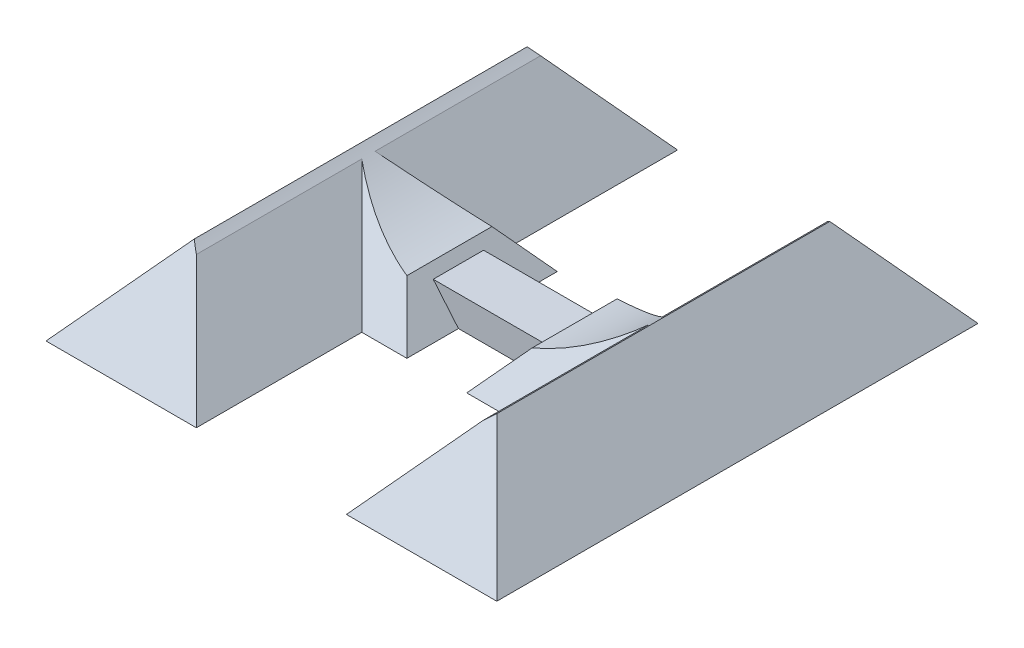
ISO-10303-21;
HEADER;
FILE_DESCRIPTION(('STEP AP214'),'2;1');
FILE_NAME('part.step','',(''),(''),'','','');
FILE_SCHEMA(('AUTOMOTIVE_DESIGN { 1 0 10303 214 1 1 1 1 }'));
ENDSEC;
DATA;
#1=APPLICATION_CONTEXT('core data for automotive mechanical design processes');
#2=APPLICATION_PROTOCOL_DEFINITION('international standard','automotive_design',2000,#1);
#3=PRODUCT_CONTEXT('',#1,'mechanical');
#4=PRODUCT('Part','Part','',(#3));
#5=PRODUCT_RELATED_PRODUCT_CATEGORY('part','',(#4));
#6=PRODUCT_DEFINITION_FORMATION('','',#4);
#7=PRODUCT_DEFINITION_CONTEXT('part definition',#1,'design');
#8=PRODUCT_DEFINITION('design','',#6,#7);
#9=PRODUCT_DEFINITION_SHAPE('','',#8);
#10=(LENGTH_UNIT() NAMED_UNIT(*) SI_UNIT(.MILLI.,.METRE.));
#11=(NAMED_UNIT(*) PLANE_ANGLE_UNIT() SI_UNIT($,.RADIAN.));
#12=(NAMED_UNIT(*) SI_UNIT($,.STERADIAN.) SOLID_ANGLE_UNIT());
#13=UNCERTAINTY_MEASURE_WITH_UNIT(LENGTH_MEASURE(1.E-05),#10,'distance_accuracy_value','');
#14=(GEOMETRIC_REPRESENTATION_CONTEXT(3) GLOBAL_UNCERTAINTY_ASSIGNED_CONTEXT((#13)) GLOBAL_UNIT_ASSIGNED_CONTEXT((#10,
#11,#12)) REPRESENTATION_CONTEXT('',''));
#15=CARTESIAN_POINT('',(0.,0.,0.));
#16=DIRECTION('',(0.,0.,1.));
#17=DIRECTION('',(1.,0.,0.));
#18=AXIS2_PLACEMENT_3D('',#15,#16,#17);
#19=CARTESIAN_POINT('',(0.,0.,0.));
#20=DIRECTION('',(-0.766044443118977,0.64278760968654,0.));
#21=DIRECTION('',(-0.64278760968654,-0.766044443118977,0.));
#22=AXIS2_PLACEMENT_3D('',#19,#20,#21);
#23=PLANE('',#22);
#24=DIRECTION('',(-0.540716203060937,-0.644400477571771,0.540716203060937));
#25=VECTOR('',#24,1.);
#26=CARTESIAN_POINT('',(0.,0.,0.));
#27=LINE('',#26,#25);
#28=CARTESIAN_POINT('',(10.8624666441013,12.9453836475425,-10.8624666441013));
#29=VERTEX_POINT('',#28);
#30=CARTESIAN_POINT('',(0.,0.,0.));
#31=VERTEX_POINT('',#30);
#32=EDGE_CURVE('E246',#29,#31,#27,.T.);
#33=ORIENTED_EDGE('',*,*,#32,.F.);
#34=DIRECTION('',(0.,0.,1.));
#35=VECTOR('',#34,1.);
#36=CARTESIAN_POINT('',(10.8624666441013,12.9453836475424,-95.));
#37=LINE('',#36,#35);
#38=CARTESIAN_POINT('',(10.8624666441013,12.9453836475425,-39.1375333558987));
#39=VERTEX_POINT('',#38);
#40=EDGE_CURVE('E286',#29,#39,#37,.F.);
#41=ORIENTED_EDGE('',*,*,#40,.T.);
#42=DIRECTION('',(-0.540716203060937,-0.64440047757177,-0.540716203060938));
#43=VECTOR('',#42,1.);
#44=CARTESIAN_POINT('',(14.6187006126319,17.4218889741631,-35.3812993873681));
#45=LINE('',#44,#43);
#46=CARTESIAN_POINT('',(0.,0.,-50.));
#47=VERTEX_POINT('',#46);
#48=EDGE_CURVE('E245',#39,#47,#45,.T.);
#49=ORIENTED_EDGE('',*,*,#48,.T.);
#50=DIRECTION('',(0.,0.,1.));
#51=VECTOR('',#50,1.);
#52=CARTESIAN_POINT('',(0.,0.,0.));
#53=LINE('',#52,#51);
#54=CARTESIAN_POINT('',(0.,0.,-33.8860531225413));
#55=VERTEX_POINT('',#54);
#56=EDGE_CURVE('E222',#47,#55,#53,.T.);
#57=ORIENTED_EDGE('',*,*,#56,.T.);
#58=DIRECTION('',(-0.64278760968654,-0.766044443118977,0.));
#59=VECTOR('',#58,1.);
#60=CARTESIAN_POINT('',(0.,0.,-33.8860531225413));
#61=LINE('',#60,#59);
#62=CARTESIAN_POINT('',(8.39099631177282,10.,-33.8860531225413));
#63=VERTEX_POINT('',#62);
#64=EDGE_CURVE('E212',#55,#63,#61,.F.);
#65=ORIENTED_EDGE('',*,*,#64,.T.);
#66=DIRECTION('',(0.,0.,1.));
#67=VECTOR('',#66,1.);
#68=CARTESIAN_POINT('',(8.39099631177282,10.,0.));
#69=LINE('',#68,#67);
#70=CARTESIAN_POINT('',(8.39099631177282,10.,-17.1472088684517));
#71=VERTEX_POINT('',#70);
#72=EDGE_CURVE('E43',#71,#63,#69,.F.);
#73=ORIENTED_EDGE('',*,*,#72,.F.);
#74=DIRECTION('',(0.64278760968654,0.766044443118977,0.));
#75=VECTOR('',#74,1.);
#76=CARTESIAN_POINT('',(0.,0.,-17.1472088684517));
#77=LINE('',#76,#75);
#78=CARTESIAN_POINT('',(0.,0.,-17.1472088684517));
#79=VERTEX_POINT('',#78);
#80=EDGE_CURVE('E218',#71,#79,#77,.F.);
#81=ORIENTED_EDGE('',*,*,#80,.T.);
#82=EDGE_CURVE('E221',#79,#31,#53,.T.);
#83=ORIENTED_EDGE('',*,*,#82,.T.);
#84=EDGE_LOOP('',(#33,#41,#49,#57,#65,#73,#81,#83));
#85=FACE_BOUND('',#84,.T.);
#86=ADVANCED_FACE('F35',(#85),#23,.T.);
#87=CARTESIAN_POINT('',(0.,0.,0.));
#88=DIRECTION('',(0.,0.64278760968654,0.766044443118977));
#89=DIRECTION('',(0.,-0.766044443118977,0.64278760968654));
#90=AXIS2_PLACEMENT_3D('',#87,#88,#89);
#91=PLANE('',#90);
#92=DIRECTION('',(-0.540716203060937,-0.644400477571771,0.540716203060937));
#93=VECTOR('',#92,1.);
#94=CARTESIAN_POINT('',(10.6143898162105,-5.22656669224895,4.38561018378957));
#95=LINE('',#94,#93);
#96=CARTESIAN_POINT('',(37.7783275264406,27.1461536629231,-22.7783275264406));
#97=VERTEX_POINT('',#96);
#98=CARTESIAN_POINT('',(15.,0.,0.));
#99=VERTEX_POINT('',#98);
#100=EDGE_CURVE('E248',#97,#99,#95,.T.);
#101=ORIENTED_EDGE('',*,*,#100,.F.);
#102=CARTESIAN_POINT('',(-9.94936322018877,85.,-71.323468650069));
#103=DIRECTION('',(0.,0.64278760968654,0.766044443118977));
#104=DIRECTION('',(0.,-0.766044443118977,0.64278760968654));
#105=AXIS2_PLACEMENT_3D('',#102,#103,#104);
#106=ELLIPSE('',#105,97.905546699921,75.);
#107=EDGE_CURVE('E291',#97,#29,#106,.F.);
#108=ORIENTED_EDGE('',*,*,#107,.T.);
#109=ORIENTED_EDGE('',*,*,#32,.T.);
#110=DIRECTION('',(1.,0.,0.));
#111=VECTOR('',#110,1.);
#112=CARTESIAN_POINT('',(0.,0.,0.));
#113=LINE('',#112,#111);
#114=EDGE_CURVE('E224',#31,#99,#113,.T.);
#115=ORIENTED_EDGE('',*,*,#114,.T.);
#116=EDGE_LOOP('',(#101,#108,#109,#115));
#117=FACE_BOUND('',#116,.T.);
#118=ADVANCED_FACE('F37',(#117),#91,.T.);
#119=CARTESIAN_POINT('',(15.,0.,0.));
#120=DIRECTION('',(-0.766044443118977,0.64278760968654,0.));
#121=DIRECTION('',(-0.64278760968654,-0.766044443118977,0.));
#122=AXIS2_PLACEMENT_3D('',#119,#120,#121);
#123=PLANE('',#122);
#124=DIRECTION('',(-0.540716203060937,-0.644400477571771,0.540716203060937));
#125=VECTOR('',#124,1.);
#126=CARTESIAN_POINT('',(29.6187006126319,17.4218889741631,40.3812993873682));
#127=LINE('',#126,#125);
#128=CARTESIAN_POINT('',(37.7783275264407,27.1461536629232,32.2216724735594));
#129=VERTEX_POINT('',#128);
#130=CARTESIAN_POINT('',(15.,0.,55.));
#131=VERTEX_POINT('',#130);
#132=EDGE_CURVE('E258',#129,#131,#127,.T.);
#133=ORIENTED_EDGE('',*,*,#132,.F.);
#134=DIRECTION('',(0.,0.,1.));
#135=VECTOR('',#134,1.);
#136=CARTESIAN_POINT('',(37.7783275264406,27.1461536629231,-95.));
#137=LINE('',#136,#135);
#138=EDGE_CURVE('E293',#129,#97,#137,.F.);
#139=ORIENTED_EDGE('',*,*,#138,.T.);
#140=ORIENTED_EDGE('',*,*,#100,.T.);
#141=DIRECTION('',(0.,0.,1.));
#142=VECTOR('',#141,1.);
#143=CARTESIAN_POINT('',(15.,0.,0.));
#144=LINE('',#143,#142);
#145=EDGE_CURVE('E227',#99,#131,#144,.T.);
#146=ORIENTED_EDGE('',*,*,#145,.T.);
#147=EDGE_LOOP('',(#133,#139,#140,#146));
#148=FACE_BOUND('',#147,.T.);
#149=ADVANCED_FACE('F373',(#148),#123,.T.);
#150=CARTESIAN_POINT('',(65.,0.,55.));
#151=DIRECTION('',(0.,0.64278760968654,0.766044443118977));
#152=DIRECTION('',(0.,-0.766044443118977,0.64278760968654));
#153=AXIS2_PLACEMENT_3D('',#150,#151,#152);
#154=PLANE('',#153);
#155=DIRECTION('',(0.540716203060937,-0.644400477571771,0.540716203060937));
#156=VECTOR('',#155,1.);
#157=CARTESIAN_POINT('',(18.2201580395781,55.750044717322,8.22015803957811));
#158=LINE('',#157,#156);
#159=CARTESIAN_POINT('',(40.3543975515309,29.3714852596117,30.3543975515309));
#160=VERTEX_POINT('',#159);
#161=CARTESIAN_POINT('',(65.,0.,55.));
#162=VERTEX_POINT('',#161);
#163=EDGE_CURVE('E256',#160,#162,#158,.T.);
#164=ORIENTED_EDGE('',*,*,#163,.F.);
#165=CARTESIAN_POINT('',(-9.94936322018877,85.,-16.323468650069));
#166=DIRECTION('',(0.,0.64278760968654,0.766044443118977));
#167=DIRECTION('',(0.,-0.766044443118977,0.64278760968654));
#168=AXIS2_PLACEMENT_3D('',#165,#166,#167);
#169=ELLIPSE('',#168,97.905546699921,75.);
#170=EDGE_CURVE('E297',#160,#129,#169,.F.);
#171=ORIENTED_EDGE('',*,*,#170,.T.);
#172=ORIENTED_EDGE('',*,*,#132,.T.);
#173=DIRECTION('',(1.,0.,0.));
#174=VECTOR('',#173,1.);
#175=CARTESIAN_POINT('',(65.,0.,55.));
#176=LINE('',#175,#174);
#177=EDGE_CURVE('E230',#131,#162,#176,.T.);
#178=ORIENTED_EDGE('',*,*,#177,.T.);
#179=EDGE_LOOP('',(#164,#171,#172,#178));
#180=FACE_BOUND('',#179,.T.);
#181=ADVANCED_FACE('F371',(#180),#154,.T.);
#182=CARTESIAN_POINT('',(65.,0.,-105.));
#183=DIRECTION('',(0.766044443118977,0.64278760968654,0.));
#184=DIRECTION('',(-0.64278760968654,0.766044443118977,0.));
#185=AXIS2_PLACEMENT_3D('',#182,#183,#184);
#186=PLANE('',#185);
#187=DIRECTION('',(0.540716203060938,-0.644400477571771,-0.540716203060937));
#188=VECTOR('',#187,1.);
#189=CARTESIAN_POINT('',(65.,0.,-105.));
#190=LINE('',#189,#188);
#191=CARTESIAN_POINT('',(40.3543975515309,29.3714852596117,-80.3543975515308));
#192=VERTEX_POINT('',#191);
#193=CARTESIAN_POINT('',(65.,0.,-105.));
#194=VERTEX_POINT('',#193);
#195=EDGE_CURVE('E254',#192,#194,#190,.T.);
#196=ORIENTED_EDGE('',*,*,#195,.F.);
#197=DIRECTION('',(0.,0.,1.));
#198=VECTOR('',#197,1.);
#199=CARTESIAN_POINT('',(40.3543975515309,29.3714852596117,-95.));
#200=LINE('',#199,#198);
#201=EDGE_CURVE('E365',#192,#160,#200,.T.);
#202=ORIENTED_EDGE('',*,*,#201,.T.);
#203=ORIENTED_EDGE('',*,*,#163,.T.);
#204=DIRECTION('',(0.,0.,-1.));
#205=VECTOR('',#204,1.);
#206=CARTESIAN_POINT('',(65.,0.,-105.));
#207=LINE('',#206,#205);
#208=EDGE_CURVE('E233',#162,#194,#207,.T.);
#209=ORIENTED_EDGE('',*,*,#208,.T.);
#210=EDGE_LOOP('',(#196,#202,#203,#209));
#211=FACE_BOUND('',#210,.T.);
#212=ADVANCED_FACE('F380',(#211),#186,.T.);
#213=CARTESIAN_POINT('',(65.,0.,-105.));
#214=DIRECTION('',(0.,0.64278760968654,-0.766044443118977));
#215=DIRECTION('',(0.,0.766044443118977,0.64278760968654));
#216=AXIS2_PLACEMENT_3D('',#213,#214,#215);
#217=PLANE('',#216);
#218=DIRECTION('',(-0.540716203060937,-0.644400477571771,-0.540716203060938));
#219=VECTOR('',#218,1.);
#220=CARTESIAN_POINT('',(15.,0.,-105.));
#221=LINE('',#220,#219);
#222=CARTESIAN_POINT('',(37.7783275264406,27.146153662923,-82.2216724735594));
#223=VERTEX_POINT('',#222);
#224=CARTESIAN_POINT('',(15.,0.,-105.));
#225=VERTEX_POINT('',#224);
#226=EDGE_CURVE('E252',#223,#225,#221,.T.);
#227=ORIENTED_EDGE('',*,*,#226,.F.);
#228=CARTESIAN_POINT('',(-9.94936322018877,85.,-33.676531349931));
#229=DIRECTION('',(0.,0.64278760968654,-0.766044443118977));
#230=DIRECTION('',(0.,0.766044443118977,0.64278760968654));
#231=AXIS2_PLACEMENT_3D('',#228,#229,#230);
#232=ELLIPSE('',#231,97.905546699921,75.);
#233=EDGE_CURVE('E362',#223,#192,#232,.F.);
#234=ORIENTED_EDGE('',*,*,#233,.T.);
#235=ORIENTED_EDGE('',*,*,#195,.T.);
#236=DIRECTION('',(-1.,0.,0.));
#237=VECTOR('',#236,1.);
#238=CARTESIAN_POINT('',(65.,0.,-105.));
#239=LINE('',#238,#237);
#240=EDGE_CURVE('E236',#194,#225,#239,.T.);
#241=ORIENTED_EDGE('',*,*,#240,.T.);
#242=EDGE_LOOP('',(#227,#234,#235,#241));
#243=FACE_BOUND('',#242,.T.);
#244=ADVANCED_FACE('F384',(#243),#217,.T.);
#245=CARTESIAN_POINT('',(15.,0.,-105.));
#246=DIRECTION('',(-0.766044443118977,0.64278760968654,0.));
#247=DIRECTION('',(-0.642787609686541,-0.766044443118977,0.));
#248=AXIS2_PLACEMENT_3D('',#245,#246,#247);
#249=PLANE('',#248);
#250=DIRECTION('',(-0.540716203060937,-0.64440047757177,-0.540716203060938));
#251=VECTOR('',#250,1.);
#252=CARTESIAN_POINT('',(-1.08057067389503,-19.1640778715795,-66.0805706738951));
#253=LINE('',#252,#251);
#254=CARTESIAN_POINT('',(37.7783275264407,27.1461536629232,-27.2216724735592));
#255=VERTEX_POINT('',#254);
#256=CARTESIAN_POINT('',(15.,0.,-50.));
#257=VERTEX_POINT('',#256);
#258=EDGE_CURVE('E250',#255,#257,#253,.T.);
#259=ORIENTED_EDGE('',*,*,#258,.F.);
#260=DIRECTION('',(0.,0.,1.));
#261=VECTOR('',#260,1.);
#262=CARTESIAN_POINT('',(37.7783275264406,27.146153662923,-95.));
#263=LINE('',#262,#261);
#264=EDGE_CURVE('E50',#255,#223,#263,.F.);
#265=ORIENTED_EDGE('',*,*,#264,.T.);
#266=ORIENTED_EDGE('',*,*,#226,.T.);
#267=DIRECTION('',(0.,0.,1.));
#268=VECTOR('',#267,1.);
#269=CARTESIAN_POINT('',(15.,0.,-105.));
#270=LINE('',#269,#268);
#271=EDGE_CURVE('E239',#225,#257,#270,.T.);
#272=ORIENTED_EDGE('',*,*,#271,.T.);
#273=EDGE_LOOP('',(#259,#265,#266,#272));
#274=FACE_BOUND('',#273,.T.);
#275=ADVANCED_FACE('F387',(#274),#249,.T.);
#276=CARTESIAN_POINT('',(0.,0.,-50.));
#277=DIRECTION('',(0.,0.64278760968654,-0.766044443118977));
#278=DIRECTION('',(0.,0.766044443118977,0.64278760968654));
#279=AXIS2_PLACEMENT_3D('',#276,#277,#278);
#280=PLANE('',#279);
#281=ORIENTED_EDGE('',*,*,#48,.F.);
#282=CARTESIAN_POINT('',(-9.94936322018877,85.,21.323468650069));
#283=DIRECTION('',(0.,0.64278760968654,-0.766044443118977));
#284=DIRECTION('',(0.,0.766044443118977,0.64278760968654));
#285=AXIS2_PLACEMENT_3D('',#282,#283,#284);
#286=ELLIPSE('',#285,97.905546699921,75.);
#287=EDGE_CURVE('E359',#39,#255,#286,.F.);
#288=ORIENTED_EDGE('',*,*,#287,.T.);
#289=ORIENTED_EDGE('',*,*,#258,.T.);
#290=DIRECTION('',(-1.,0.,0.));
#291=VECTOR('',#290,1.);
#292=CARTESIAN_POINT('',(0.,0.,-50.));
#293=LINE('',#292,#291);
#294=EDGE_CURVE('E242',#257,#47,#293,.T.);
#295=ORIENTED_EDGE('',*,*,#294,.T.);
#296=EDGE_LOOP('',(#281,#288,#289,#295));
#297=FACE_BOUND('',#296,.T.);
#298=ADVANCED_FACE('F390',(#297),#280,.T.);
#299=CARTESIAN_POINT('',(0.,0.,0.));
#300=DIRECTION('',(0.,-1.,0.));
#301=DIRECTION('',(0.,0.,-1.));
#302=AXIS2_PLACEMENT_3D('',#299,#300,#301);
#303=PLANE('',#302);
#304=ORIENTED_EDGE('',*,*,#82,.F.);
#305=DIRECTION('',(-1.,0.,0.));
#306=VECTOR('',#305,1.);
#307=CARTESIAN_POINT('',(-9.94936322018877,0.,-17.1472088684517));
#308=LINE('',#307,#306);
#309=CARTESIAN_POINT('',(-19.8987264403775,0.,-17.1472088684517));
#310=VERTEX_POINT('',#309);
#311=EDGE_CURVE('E210',#79,#310,#308,.T.);
#312=ORIENTED_EDGE('',*,*,#311,.T.);
#313=DIRECTION('',(0.,0.,1.));
#314=VECTOR('',#313,1.);
#315=CARTESIAN_POINT('',(-19.8987264403775,0.,0.));
#316=LINE('',#315,#314);
#317=CARTESIAN_POINT('',(-19.8987264403775,0.,0.));
#318=VERTEX_POINT('',#317);
#319=EDGE_CURVE('E282',#310,#318,#316,.T.);
#320=ORIENTED_EDGE('',*,*,#319,.T.);
#321=DIRECTION('',(-1.,0.,0.));
#322=VECTOR('',#321,1.);
#323=CARTESIAN_POINT('',(-19.8987264403775,0.,0.));
#324=LINE('',#323,#322);
#325=CARTESIAN_POINT('',(-34.8987264403776,0.,0.));
#326=VERTEX_POINT('',#325);
#327=EDGE_CURVE('E306',#318,#326,#324,.T.);
#328=ORIENTED_EDGE('',*,*,#327,.T.);
#329=DIRECTION('',(0.,0.,1.));
#330=VECTOR('',#329,1.);
#331=CARTESIAN_POINT('',(-34.8987264403776,0.,0.));
#332=LINE('',#331,#330);
#333=CARTESIAN_POINT('',(-34.8987264403776,0.,55.));
#334=VERTEX_POINT('',#333);
#335=EDGE_CURVE('E308',#326,#334,#332,.T.);
#336=ORIENTED_EDGE('',*,*,#335,.T.);
#337=DIRECTION('',(-1.,0.,0.));
#338=VECTOR('',#337,1.);
#339=CARTESIAN_POINT('',(-84.8987264403776,0.,55.));
#340=LINE('',#339,#338);
#341=CARTESIAN_POINT('',(-84.8987264403776,0.,55.));
#342=VERTEX_POINT('',#341);
#343=EDGE_CURVE('E311',#334,#342,#340,.T.);
#344=ORIENTED_EDGE('',*,*,#343,.T.);
#345=DIRECTION('',(0.,0.,-1.));
#346=VECTOR('',#345,1.);
#347=CARTESIAN_POINT('',(-84.8987264403776,0.,-105.));
#348=LINE('',#347,#346);
#349=CARTESIAN_POINT('',(-84.8987264403776,0.,-105.));
#350=VERTEX_POINT('',#349);
#351=EDGE_CURVE('E314',#342,#350,#348,.T.);
#352=ORIENTED_EDGE('',*,*,#351,.T.);
#353=DIRECTION('',(1.,0.,0.));
#354=VECTOR('',#353,1.);
#355=CARTESIAN_POINT('',(-84.8987264403776,0.,-105.));
#356=LINE('',#355,#354);
#357=CARTESIAN_POINT('',(-34.8987264403776,0.,-105.));
#358=VERTEX_POINT('',#357);
#359=EDGE_CURVE('E317',#350,#358,#356,.T.);
#360=ORIENTED_EDGE('',*,*,#359,.T.);
#361=DIRECTION('',(0.,0.,1.));
#362=VECTOR('',#361,1.);
#363=CARTESIAN_POINT('',(-34.8987264403776,0.,-105.));
#364=LINE('',#363,#362);
#365=CARTESIAN_POINT('',(-34.8987264403776,0.,-50.));
#366=VERTEX_POINT('',#365);
#367=EDGE_CURVE('E320',#358,#366,#364,.T.);
#368=ORIENTED_EDGE('',*,*,#367,.T.);
#369=DIRECTION('',(1.,0.,0.));
#370=VECTOR('',#369,1.);
#371=CARTESIAN_POINT('',(-19.8987264403775,0.,-50.));
#372=LINE('',#371,#370);
#373=CARTESIAN_POINT('',(-19.8987264403775,0.,-50.));
#374=VERTEX_POINT('',#373);
#375=EDGE_CURVE('E186',#366,#374,#372,.T.);
#376=ORIENTED_EDGE('',*,*,#375,.T.);
#377=CARTESIAN_POINT('',(-19.8987264403775,0.,-33.8860531225413));
#378=VERTEX_POINT('',#377);
#379=EDGE_CURVE('E303',#374,#378,#316,.T.);
#380=ORIENTED_EDGE('',*,*,#379,.T.);
#381=DIRECTION('',(1.,0.,0.));
#382=VECTOR('',#381,1.);
#383=CARTESIAN_POINT('',(-9.94936322018877,0.,-33.8860531225413));
#384=LINE('',#383,#382);
#385=EDGE_CURVE('E206',#378,#55,#384,.T.);
#386=ORIENTED_EDGE('',*,*,#385,.T.);
#387=ORIENTED_EDGE('',*,*,#56,.F.);
#388=ORIENTED_EDGE('',*,*,#294,.F.);
#389=ORIENTED_EDGE('',*,*,#271,.F.);
#390=ORIENTED_EDGE('',*,*,#240,.F.);
#391=ORIENTED_EDGE('',*,*,#208,.F.);
#392=ORIENTED_EDGE('',*,*,#177,.F.);
#393=ORIENTED_EDGE('',*,*,#145,.F.);
#394=ORIENTED_EDGE('',*,*,#114,.F.);
#395=EDGE_LOOP('',(#304,#312,#320,#328,#336,#344,#352,#360,#368,#376,#380,#386,#387,#388,#389,
#390,#391,#392,#393,#394));
#396=FACE_BOUND('',#395,.T.);
#397=ADVANCED_FACE('F280',(#396),#303,.T.);
#398=CARTESIAN_POINT('',(0.,10.,0.));
#399=DIRECTION('',(0.,-1.,0.));
#400=DIRECTION('',(0.,0.,-1.));
#401=AXIS2_PLACEMENT_3D('',#398,#399,#400);
#402=PLANE('',#401);
#403=ORIENTED_EDGE('',*,*,#72,.T.);
#404=DIRECTION('',(1.,0.,0.));
#405=VECTOR('',#404,1.);
#406=CARTESIAN_POINT('',(-9.94936322018877,10.,-33.8860531225413));
#407=LINE('',#406,#405);
#408=CARTESIAN_POINT('',(-28.2897227521504,10.,-33.8860531225413));
#409=VERTEX_POINT('',#408);
#410=EDGE_CURVE('E207',#409,#63,#407,.T.);
#411=ORIENTED_EDGE('',*,*,#410,.F.);
#412=DIRECTION('',(0.,0.,1.));
#413=VECTOR('',#412,1.);
#414=CARTESIAN_POINT('',(-28.2897227521504,10.,0.));
#415=LINE('',#414,#413);
#416=CARTESIAN_POINT('',(-28.2897227521504,10.,-17.1472088684517));
#417=VERTEX_POINT('',#416);
#418=EDGE_CURVE('E203',#417,#409,#415,.F.);
#419=ORIENTED_EDGE('',*,*,#418,.F.);
#420=DIRECTION('',(-1.,0.,0.));
#421=VECTOR('',#420,1.);
#422=CARTESIAN_POINT('',(-9.94936322018877,10.,-17.1472088684517));
#423=LINE('',#422,#421);
#424=EDGE_CURVE('E209',#71,#417,#423,.T.);
#425=ORIENTED_EDGE('',*,*,#424,.F.);
#426=EDGE_LOOP('',(#403,#411,#419,#425));
#427=FACE_BOUND('',#426,.T.);
#428=ADVANCED_FACE('F263',(#427),#402,.F.);
#429=CARTESIAN_POINT('',(-9.94936322018877,10.,-17.1472088684517));
#430=DIRECTION('',(0.,0.,1.));
#431=DIRECTION('',(1.,0.,0.));
#432=AXIS2_PLACEMENT_3D('',#429,#430,#431);
#433=PLANE('',#432);
#434=ORIENTED_EDGE('',*,*,#80,.F.);
#435=ORIENTED_EDGE('',*,*,#424,.T.);
#436=DIRECTION('',(-0.64278760968654,0.766044443118977,0.));
#437=VECTOR('',#436,1.);
#438=CARTESIAN_POINT('',(-19.8987264403775,0.,-17.1472088684517));
#439=LINE('',#438,#437);
#440=EDGE_CURVE('E276',#417,#310,#439,.F.);
#441=ORIENTED_EDGE('',*,*,#440,.T.);
#442=ORIENTED_EDGE('',*,*,#311,.F.);
#443=EDGE_LOOP('',(#434,#435,#441,#442));
#444=FACE_BOUND('',#443,.T.);
#445=ADVANCED_FACE('F273',(#444),#433,.T.);
#446=CARTESIAN_POINT('',(-9.94936322018877,10.,-33.8860531225413));
#447=DIRECTION('',(0.,0.,-1.));
#448=DIRECTION('',(-1.,0.,0.));
#449=AXIS2_PLACEMENT_3D('',#446,#447,#448);
#450=PLANE('',#449);
#451=ORIENTED_EDGE('',*,*,#64,.F.);
#452=ORIENTED_EDGE('',*,*,#385,.F.);
#453=DIRECTION('',(0.64278760968654,-0.766044443118977,0.));
#454=VECTOR('',#453,1.);
#455=CARTESIAN_POINT('',(-19.8987264403775,0.,-33.8860531225413));
#456=LINE('',#455,#454);
#457=EDGE_CURVE('E295',#378,#409,#456,.F.);
#458=ORIENTED_EDGE('',*,*,#457,.T.);
#459=ORIENTED_EDGE('',*,*,#410,.T.);
#460=EDGE_LOOP('',(#451,#452,#458,#459));
#461=FACE_BOUND('',#460,.T.);
#462=ADVANCED_FACE('F393',(#461),#450,.T.);
#463=CARTESIAN_POINT('',(-19.8987264403775,0.,0.));
#464=DIRECTION('',(0.766044443118977,0.64278760968654,0.));
#465=DIRECTION('',(0.64278760968654,-0.766044443118977,0.));
#466=AXIS2_PLACEMENT_3D('',#463,#464,#465);
#467=PLANE('',#466);
#468=DIRECTION('',(0.540716203060937,-0.64440047757177,-0.540716203060938));
#469=VECTOR('',#468,1.);
#470=CARTESIAN_POINT('',(-34.5174270530094,17.4218889741631,-35.3812993873681));
#471=LINE('',#470,#469);
#472=CARTESIAN_POINT('',(-30.7611930844789,12.9453836475425,-39.1375333558987));
#473=VERTEX_POINT('',#472);
#474=EDGE_CURVE('E188',#473,#374,#471,.T.);
#475=ORIENTED_EDGE('',*,*,#474,.F.);
#476=DIRECTION('',(0.,0.,1.));
#477=VECTOR('',#476,1.);
#478=CARTESIAN_POINT('',(-30.7611930844788,12.9453836475424,-95.));
#479=LINE('',#478,#477);
#480=CARTESIAN_POINT('',(-30.7611930844788,12.9453836475425,-10.8624666441013));
#481=VERTEX_POINT('',#480);
#482=EDGE_CURVE('E58',#473,#481,#479,.T.);
#483=ORIENTED_EDGE('',*,*,#482,.T.);
#484=DIRECTION('',(0.540716203060937,-0.644400477571771,0.540716203060937));
#485=VECTOR('',#484,1.);
#486=CARTESIAN_POINT('',(-19.8987264403775,0.,0.));
#487=LINE('',#486,#485);
#488=EDGE_CURVE('E202',#481,#318,#487,.T.);
#489=ORIENTED_EDGE('',*,*,#488,.T.);
#490=ORIENTED_EDGE('',*,*,#319,.F.);
#491=ORIENTED_EDGE('',*,*,#440,.F.);
#492=ORIENTED_EDGE('',*,*,#418,.T.);
#493=ORIENTED_EDGE('',*,*,#457,.F.);
#494=ORIENTED_EDGE('',*,*,#379,.F.);
#495=EDGE_LOOP('',(#475,#483,#489,#490,#491,#492,#493,#494));
#496=FACE_BOUND('',#495,.T.);
#497=ADVANCED_FACE('F325',(#496),#467,.T.);
#498=CARTESIAN_POINT('',(-19.8987264403775,0.,0.));
#499=DIRECTION('',(0.,0.64278760968654,0.766044443118977));
#500=DIRECTION('',(0.,-0.766044443118977,0.64278760968654));
#501=AXIS2_PLACEMENT_3D('',#498,#499,#500);
#502=PLANE('',#501);
#503=ORIENTED_EDGE('',*,*,#488,.F.);
#504=CARTESIAN_POINT('',(-9.94936322018877,85.,-71.323468650069));
#505=DIRECTION('',(0.,0.64278760968654,0.766044443118977));
#506=DIRECTION('',(0.,-0.766044443118977,0.64278760968654));
#507=AXIS2_PLACEMENT_3D('',#504,#505,#506);
#508=ELLIPSE('',#507,97.905546699921,75.);
#509=CARTESIAN_POINT('',(-57.6770539668182,27.1461536629231,-22.7783275264406));
#510=VERTEX_POINT('',#509);
#511=EDGE_CURVE('E356',#481,#510,#508,.F.);
#512=ORIENTED_EDGE('',*,*,#511,.T.);
#513=DIRECTION('',(0.540716203060937,-0.644400477571771,0.540716203060937));
#514=VECTOR('',#513,1.);
#515=CARTESIAN_POINT('',(-30.513116256588,-5.22656669224895,4.38561018378957));
#516=LINE('',#515,#514);
#517=EDGE_CURVE('E200',#510,#326,#516,.T.);
#518=ORIENTED_EDGE('',*,*,#517,.T.);
#519=ORIENTED_EDGE('',*,*,#327,.F.);
#520=EDGE_LOOP('',(#503,#512,#518,#519));
#521=FACE_BOUND('',#520,.T.);
#522=ADVANCED_FACE('F328',(#521),#502,.T.);
#523=CARTESIAN_POINT('',(-34.8987264403776,0.,0.));
#524=DIRECTION('',(0.766044443118977,0.64278760968654,0.));
#525=DIRECTION('',(0.64278760968654,-0.766044443118977,0.));
#526=AXIS2_PLACEMENT_3D('',#523,#524,#525);
#527=PLANE('',#526);
#528=ORIENTED_EDGE('',*,*,#517,.F.);
#529=DIRECTION('',(0.,0.,1.));
#530=VECTOR('',#529,1.);
#531=CARTESIAN_POINT('',(-57.6770539668182,27.1461536629231,-95.));
#532=LINE('',#531,#530);
#533=CARTESIAN_POINT('',(-57.6770539668182,27.1461536629232,32.2216724735594));
#534=VERTEX_POINT('',#533);
#535=EDGE_CURVE('E336',#510,#534,#532,.T.);
#536=ORIENTED_EDGE('',*,*,#535,.T.);
#537=DIRECTION('',(0.540716203060937,-0.644400477571771,0.540716203060937));
#538=VECTOR('',#537,1.);
#539=CARTESIAN_POINT('',(-49.5174270530094,17.4218889741631,40.3812993873682));
#540=LINE('',#539,#538);
#541=EDGE_CURVE('E198',#534,#334,#540,.T.);
#542=ORIENTED_EDGE('',*,*,#541,.T.);
#543=ORIENTED_EDGE('',*,*,#335,.F.);
#544=EDGE_LOOP('',(#528,#536,#542,#543));
#545=FACE_BOUND('',#544,.T.);
#546=ADVANCED_FACE('F333',(#545),#527,.T.);
#547=CARTESIAN_POINT('',(-84.8987264403776,0.,55.));
#548=DIRECTION('',(0.,0.64278760968654,0.766044443118977));
#549=DIRECTION('',(0.,-0.766044443118977,0.64278760968654));
#550=AXIS2_PLACEMENT_3D('',#547,#548,#549);
#551=PLANE('',#550);
#552=ORIENTED_EDGE('',*,*,#541,.F.);
#553=CARTESIAN_POINT('',(-9.94936322018877,85.,-16.323468650069));
#554=DIRECTION('',(0.,0.64278760968654,0.766044443118977));
#555=DIRECTION('',(0.,-0.766044443118977,0.64278760968654));
#556=AXIS2_PLACEMENT_3D('',#553,#554,#555);
#557=ELLIPSE('',#556,97.905546699921,75.);
#558=CARTESIAN_POINT('',(-60.2531239919084,29.3714852596117,30.3543975515309));
#559=VERTEX_POINT('',#558);
#560=EDGE_CURVE('E342',#534,#559,#557,.F.);
#561=ORIENTED_EDGE('',*,*,#560,.T.);
#562=DIRECTION('',(-0.540716203060937,-0.644400477571771,0.540716203060937));
#563=VECTOR('',#562,1.);
#564=CARTESIAN_POINT('',(-38.1188844799557,55.750044717322,8.22015803957811));
#565=LINE('',#564,#563);
#566=EDGE_CURVE('E196',#559,#342,#565,.T.);
#567=ORIENTED_EDGE('',*,*,#566,.T.);
#568=ORIENTED_EDGE('',*,*,#343,.F.);
#569=EDGE_LOOP('',(#552,#561,#567,#568));
#570=FACE_BOUND('',#569,.T.);
#571=ADVANCED_FACE('F339',(#570),#551,.T.);
#572=CARTESIAN_POINT('',(-84.8987264403776,0.,-105.));
#573=DIRECTION('',(-0.766044443118977,0.64278760968654,0.));
#574=DIRECTION('',(0.64278760968654,0.766044443118977,0.));
#575=AXIS2_PLACEMENT_3D('',#572,#573,#574);
#576=PLANE('',#575);
#577=ORIENTED_EDGE('',*,*,#566,.F.);
#578=DIRECTION('',(0.,0.,1.));
#579=VECTOR('',#578,1.);
#580=CARTESIAN_POINT('',(-60.2531239919084,29.3714852596117,-95.));
#581=LINE('',#580,#579);
#582=CARTESIAN_POINT('',(-60.2531239919084,29.3714852596117,-80.3543975515308));
#583=VERTEX_POINT('',#582);
#584=EDGE_CURVE('E350',#559,#583,#581,.F.);
#585=ORIENTED_EDGE('',*,*,#584,.T.);
#586=DIRECTION('',(-0.540716203060938,-0.644400477571771,-0.540716203060937));
#587=VECTOR('',#586,1.);
#588=CARTESIAN_POINT('',(-84.8987264403776,0.,-105.));
#589=LINE('',#588,#587);
#590=EDGE_CURVE('E190',#583,#350,#589,.T.);
#591=ORIENTED_EDGE('',*,*,#590,.T.);
#592=ORIENTED_EDGE('',*,*,#351,.F.);
#593=EDGE_LOOP('',(#577,#585,#591,#592));
#594=FACE_BOUND('',#593,.T.);
#595=ADVANCED_FACE('F345',(#594),#576,.T.);
#596=CARTESIAN_POINT('',(-84.8987264403776,0.,-105.));
#597=DIRECTION('',(0.,0.64278760968654,-0.766044443118977));
#598=DIRECTION('',(0.,0.766044443118977,0.64278760968654));
#599=AXIS2_PLACEMENT_3D('',#596,#597,#598);
#600=PLANE('',#599);
#601=ORIENTED_EDGE('',*,*,#590,.F.);
#602=CARTESIAN_POINT('',(-9.94936322018877,85.,-33.676531349931));
#603=DIRECTION('',(0.,0.64278760968654,-0.766044443118977));
#604=DIRECTION('',(0.,0.766044443118977,0.64278760968654));
#605=AXIS2_PLACEMENT_3D('',#602,#603,#604);
#606=ELLIPSE('',#605,97.905546699921,75.);
#607=CARTESIAN_POINT('',(-57.6770539668181,27.146153662923,-82.2216724735594));
#608=VERTEX_POINT('',#607);
#609=EDGE_CURVE('E182',#583,#608,#606,.F.);
#610=ORIENTED_EDGE('',*,*,#609,.T.);
#611=DIRECTION('',(0.540716203060937,-0.644400477571771,-0.540716203060938));
#612=VECTOR('',#611,1.);
#613=CARTESIAN_POINT('',(-34.8987264403776,0.,-105.));
#614=LINE('',#613,#612);
#615=EDGE_CURVE('E181',#608,#358,#614,.T.);
#616=ORIENTED_EDGE('',*,*,#615,.T.);
#617=ORIENTED_EDGE('',*,*,#359,.F.);
#618=EDGE_LOOP('',(#601,#610,#616,#617));
#619=FACE_BOUND('',#618,.T.);
#620=ADVANCED_FACE('F349',(#619),#600,.T.);
#621=CARTESIAN_POINT('',(-34.8987264403776,0.,-105.));
#622=DIRECTION('',(0.766044443118977,0.64278760968654,0.));
#623=DIRECTION('',(0.642787609686541,-0.766044443118977,0.));
#624=AXIS2_PLACEMENT_3D('',#621,#622,#623);
#625=PLANE('',#624);
#626=ORIENTED_EDGE('',*,*,#615,.F.);
#627=DIRECTION('',(0.,0.,1.));
#628=VECTOR('',#627,1.);
#629=CARTESIAN_POINT('',(-57.6770539668181,27.146153662923,-95.));
#630=LINE('',#629,#628);
#631=CARTESIAN_POINT('',(-57.6770539668183,27.1461536629232,-27.2216724735592));
#632=VERTEX_POINT('',#631);
#633=EDGE_CURVE('E170',#608,#632,#630,.T.);
#634=ORIENTED_EDGE('',*,*,#633,.T.);
#635=DIRECTION('',(0.540716203060937,-0.64440047757177,-0.540716203060938));
#636=VECTOR('',#635,1.);
#637=CARTESIAN_POINT('',(-18.8181557664825,-19.1640778715795,-66.0805706738951));
#638=LINE('',#637,#636);
#639=EDGE_CURVE('E179',#632,#366,#638,.T.);
#640=ORIENTED_EDGE('',*,*,#639,.T.);
#641=ORIENTED_EDGE('',*,*,#367,.F.);
#642=EDGE_LOOP('',(#626,#634,#640,#641));
#643=FACE_BOUND('',#642,.T.);
#644=ADVANCED_FACE('F177',(#643),#625,.T.);
#645=CARTESIAN_POINT('',(-19.8987264403775,0.,-50.));
#646=DIRECTION('',(0.,0.64278760968654,-0.766044443118977));
#647=DIRECTION('',(0.,0.766044443118977,0.64278760968654));
#648=AXIS2_PLACEMENT_3D('',#645,#646,#647);
#649=PLANE('',#648);
#650=ORIENTED_EDGE('',*,*,#639,.F.);
#651=CARTESIAN_POINT('',(-9.94936322018877,85.,21.323468650069));
#652=DIRECTION('',(0.,0.64278760968654,-0.766044443118977));
#653=DIRECTION('',(0.,0.766044443118977,0.64278760968654));
#654=AXIS2_PLACEMENT_3D('',#651,#652,#653);
#655=ELLIPSE('',#654,97.905546699921,75.);
#656=EDGE_CURVE('E11',#632,#473,#655,.F.);
#657=ORIENTED_EDGE('',*,*,#656,.T.);
#658=ORIENTED_EDGE('',*,*,#474,.T.);
#659=ORIENTED_EDGE('',*,*,#375,.F.);
#660=EDGE_LOOP('',(#650,#657,#658,#659));
#661=FACE_BOUND('',#660,.T.);
#662=ADVANCED_FACE('F184',(#661),#649,.T.);
#663=CARTESIAN_POINT('',(-9.94936322018877,85.,-95.));
#664=DIRECTION('',(0.,0.,1.));
#665=DIRECTION('',(1.,0.,0.));
#666=AXIS2_PLACEMENT_3D('',#663,#664,#665);
#667=CYLINDRICAL_SURFACE('',#666,75.);
#668=ORIENTED_EDGE('',*,*,#656,.F.);
#669=ORIENTED_EDGE('',*,*,#633,.F.);
#670=ORIENTED_EDGE('',*,*,#609,.F.);
#671=ORIENTED_EDGE('',*,*,#584,.F.);
#672=ORIENTED_EDGE('',*,*,#560,.F.);
#673=ORIENTED_EDGE('',*,*,#535,.F.);
#674=ORIENTED_EDGE('',*,*,#511,.F.);
#675=ORIENTED_EDGE('',*,*,#482,.F.);
#676=EDGE_LOOP('',(#668,#669,#670,#671,#672,#673,#674,#675));
#677=FACE_BOUND('',#676,.T.);
#678=ADVANCED_FACE('F169',(#677),#667,.F.);
#679=ORIENTED_EDGE('',*,*,#107,.F.);
#680=ORIENTED_EDGE('',*,*,#138,.F.);
#681=ORIENTED_EDGE('',*,*,#170,.F.);
#682=ORIENTED_EDGE('',*,*,#201,.F.);
#683=ORIENTED_EDGE('',*,*,#233,.F.);
#684=ORIENTED_EDGE('',*,*,#264,.F.);
#685=ORIENTED_EDGE('',*,*,#287,.F.);
#686=ORIENTED_EDGE('',*,*,#40,.F.);
#687=EDGE_LOOP('',(#679,#680,#681,#682,#683,#684,#685,#686));
#688=FACE_BOUND('',#687,.T.);
#689=ADVANCED_FACE('F381',(#688),#667,.F.);
#690=CLOSED_SHELL('',(#86,#118,#149,#181,#212,#244,#275,#298,#397,#428,#445,#462,#497,#522,#546,
#571,#595,#620,#644,#662,#678,#689));
#691=MANIFOLD_SOLID_BREP('B2',#690);
#692=ADVANCED_BREP_SHAPE_REPRESENTATION('',(#18,#691),#14);
#693=SHAPE_DEFINITION_REPRESENTATION(#9,#692);
ENDSEC;
END-ISO-10303-21;
